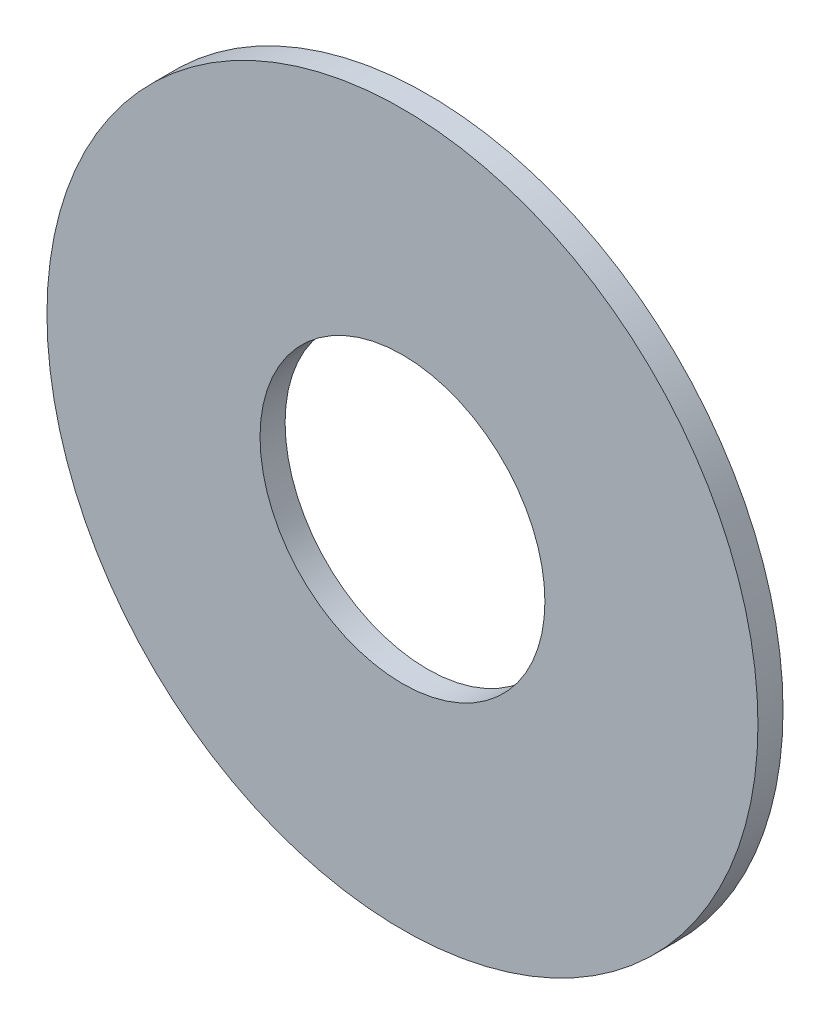
ISO-10303-21;
HEADER;
FILE_DESCRIPTION(('STEP AP214'),'2;1');
FILE_NAME('part.step','',(''),(''),'','','');
FILE_SCHEMA(('AUTOMOTIVE_DESIGN { 1 0 10303 214 1 1 1 1 }'));
ENDSEC;
DATA;
#1=APPLICATION_CONTEXT('core data for automotive mechanical design processes');
#2=APPLICATION_PROTOCOL_DEFINITION('international standard','automotive_design',2000,#1);
#3=PRODUCT_CONTEXT('',#1,'mechanical');
#4=PRODUCT('Part','Part','',(#3));
#5=PRODUCT_RELATED_PRODUCT_CATEGORY('part','',(#4));
#6=PRODUCT_DEFINITION_FORMATION('','',#4);
#7=PRODUCT_DEFINITION_CONTEXT('part definition',#1,'design');
#8=PRODUCT_DEFINITION('design','',#6,#7);
#9=PRODUCT_DEFINITION_SHAPE('','',#8);
#10=(LENGTH_UNIT() NAMED_UNIT(*) SI_UNIT(.MILLI.,.METRE.));
#11=(NAMED_UNIT(*) PLANE_ANGLE_UNIT() SI_UNIT($,.RADIAN.));
#12=(NAMED_UNIT(*) SI_UNIT($,.STERADIAN.) SOLID_ANGLE_UNIT());
#13=UNCERTAINTY_MEASURE_WITH_UNIT(LENGTH_MEASURE(1.E-05),#10,'distance_accuracy_value','');
#14=(GEOMETRIC_REPRESENTATION_CONTEXT(3) GLOBAL_UNCERTAINTY_ASSIGNED_CONTEXT((#13)) GLOBAL_UNIT_ASSIGNED_CONTEXT((#10,
#11,#12)) REPRESENTATION_CONTEXT('',''));
#15=CARTESIAN_POINT('',(0.,0.,0.));
#16=DIRECTION('',(0.,0.,1.));
#17=DIRECTION('',(1.,0.,0.));
#18=AXIS2_PLACEMENT_3D('',#15,#16,#17);
#19=CARTESIAN_POINT('',(0.,0.,0.79375));
#20=DIRECTION('',(0.,0.,1.));
#21=DIRECTION('',(1.,0.,0.));
#22=AXIS2_PLACEMENT_3D('',#19,#20,#21);
#23=PLANE('',#22);
#24=CARTESIAN_POINT('',(0.,0.,0.79375));
#25=DIRECTION('',(0.,0.,1.));
#26=DIRECTION('',(1.,0.,0.));
#27=AXIS2_PLACEMENT_3D('',#24,#25,#26);
#28=CIRCLE('',#27,11.2522);
#29=CARTESIAN_POINT('',(11.2522,0.,0.79375));
#30=VERTEX_POINT('',#29);
#31=EDGE_CURVE('E10',#30,#30,#28,.T.);
#32=ORIENTED_EDGE('',*,*,#31,.T.);
#33=EDGE_LOOP('',(#32));
#34=FACE_BOUND('',#33,.T.);
#35=CARTESIAN_POINT('',(0.,0.,0.79375));
#36=DIRECTION('',(0.,0.,1.));
#37=DIRECTION('',(1.,0.,0.));
#38=AXIS2_PLACEMENT_3D('',#35,#36,#37);
#39=CIRCLE('',#38,4.5085);
#40=CARTESIAN_POINT('',(4.5085,0.,0.79375));
#41=VERTEX_POINT('',#40);
#42=EDGE_CURVE('E45',#41,#41,#39,.T.);
#43=ORIENTED_EDGE('',*,*,#42,.F.);
#44=EDGE_LOOP('',(#43));
#45=FACE_BOUND('',#44,.T.);
#46=ADVANCED_FACE('F34',(#34,#45),#23,.T.);
#47=CARTESIAN_POINT('',(0.,0.,0.));
#48=DIRECTION('',(0.,0.,1.));
#49=DIRECTION('',(1.,0.,0.));
#50=AXIS2_PLACEMENT_3D('',#47,#48,#49);
#51=PLANE('',#50);
#52=CARTESIAN_POINT('',(0.,0.,0.));
#53=DIRECTION('',(0.,0.,1.));
#54=DIRECTION('',(1.,0.,0.));
#55=AXIS2_PLACEMENT_3D('',#52,#53,#54);
#56=CIRCLE('',#55,11.2522);
#57=CARTESIAN_POINT('',(11.2522,0.,0.));
#58=VERTEX_POINT('',#57);
#59=EDGE_CURVE('E38',#58,#58,#56,.T.);
#60=ORIENTED_EDGE('',*,*,#59,.F.);
#61=EDGE_LOOP('',(#60));
#62=FACE_BOUND('',#61,.T.);
#63=CARTESIAN_POINT('',(0.,0.,0.));
#64=DIRECTION('',(0.,0.,1.));
#65=DIRECTION('',(1.,0.,0.));
#66=AXIS2_PLACEMENT_3D('',#63,#64,#65);
#67=CIRCLE('',#66,4.5085);
#68=CARTESIAN_POINT('',(4.5085,0.,0.));
#69=VERTEX_POINT('',#68);
#70=EDGE_CURVE('E47',#69,#69,#67,.T.);
#71=ORIENTED_EDGE('',*,*,#70,.T.);
#72=EDGE_LOOP('',(#71));
#73=FACE_BOUND('',#72,.T.);
#74=ADVANCED_FACE('F57',(#62,#73),#51,.F.);
#75=CARTESIAN_POINT('',(0.,0.,0.79375));
#76=DIRECTION('',(0.,0.,-1.));
#77=DIRECTION('',(-1.,0.,0.));
#78=AXIS2_PLACEMENT_3D('',#75,#76,#77);
#79=CYLINDRICAL_SURFACE('',#78,11.2522);
#80=ORIENTED_EDGE('',*,*,#31,.F.);
#81=EDGE_LOOP('',(#80));
#82=FACE_BOUND('',#81,.T.);
#83=ORIENTED_EDGE('',*,*,#59,.T.);
#84=EDGE_LOOP('',(#83));
#85=FACE_BOUND('',#84,.T.);
#86=ADVANCED_FACE('F36',(#82,#85),#79,.T.);
#87=CARTESIAN_POINT('',(0.,0.,0.79375));
#88=DIRECTION('',(0.,0.,-1.));
#89=DIRECTION('',(-1.,0.,0.));
#90=AXIS2_PLACEMENT_3D('',#87,#88,#89);
#91=CYLINDRICAL_SURFACE('',#90,4.5085);
#92=ORIENTED_EDGE('',*,*,#42,.T.);
#93=EDGE_LOOP('',(#92));
#94=FACE_BOUND('',#93,.T.);
#95=ORIENTED_EDGE('',*,*,#70,.F.);
#96=EDGE_LOOP('',(#95));
#97=FACE_BOUND('',#96,.T.);
#98=ADVANCED_FACE('F53',(#94,#97),#91,.F.);
#99=CLOSED_SHELL('',(#46,#74,#86,#98));
#100=MANIFOLD_SOLID_BREP('B2',#99);
#101=ADVANCED_BREP_SHAPE_REPRESENTATION('',(#18,#100),#14);
#102=SHAPE_DEFINITION_REPRESENTATION(#9,#101);
ENDSEC;
END-ISO-10303-21;
